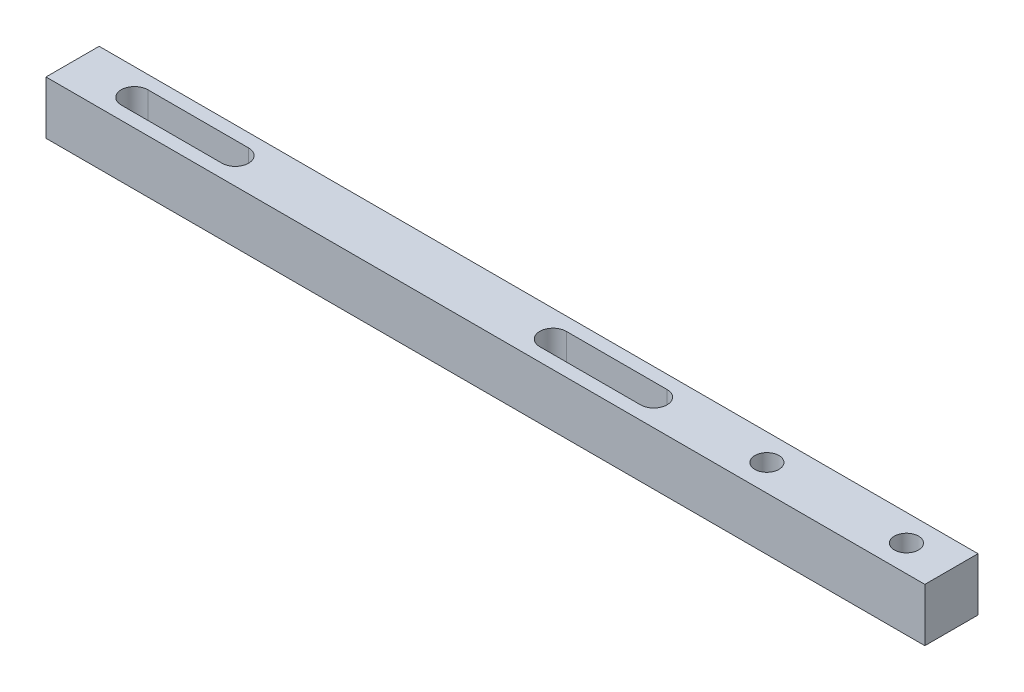
ISO-10303-21;
HEADER;
FILE_DESCRIPTION(('STEP AP214'),'2;1');
FILE_NAME('part.step','',(''),(''),'','','');
FILE_SCHEMA(('AUTOMOTIVE_DESIGN { 1 0 10303 214 1 1 1 1 }'));
ENDSEC;
DATA;
#1=APPLICATION_CONTEXT('core data for automotive mechanical design processes');
#2=APPLICATION_PROTOCOL_DEFINITION('international standard','automotive_design',2000,#1);
#3=PRODUCT_CONTEXT('',#1,'mechanical');
#4=PRODUCT('Part','Part','',(#3));
#5=PRODUCT_RELATED_PRODUCT_CATEGORY('part','',(#4));
#6=PRODUCT_DEFINITION_FORMATION('','',#4);
#7=PRODUCT_DEFINITION_CONTEXT('part definition',#1,'design');
#8=PRODUCT_DEFINITION('design','',#6,#7);
#9=PRODUCT_DEFINITION_SHAPE('','',#8);
#10=(LENGTH_UNIT() NAMED_UNIT(*) SI_UNIT(.MILLI.,.METRE.));
#11=(NAMED_UNIT(*) PLANE_ANGLE_UNIT() SI_UNIT($,.RADIAN.));
#12=(NAMED_UNIT(*) SI_UNIT($,.STERADIAN.) SOLID_ANGLE_UNIT());
#13=UNCERTAINTY_MEASURE_WITH_UNIT(LENGTH_MEASURE(1.E-05),#10,'distance_accuracy_value','');
#14=(GEOMETRIC_REPRESENTATION_CONTEXT(3) GLOBAL_UNCERTAINTY_ASSIGNED_CONTEXT((#13)) GLOBAL_UNIT_ASSIGNED_CONTEXT((#10,
#11,#12)) REPRESENTATION_CONTEXT('',''));
#15=CARTESIAN_POINT('',(0.,0.,0.));
#16=DIRECTION('',(0.,0.,1.));
#17=DIRECTION('',(1.,0.,0.));
#18=AXIS2_PLACEMENT_3D('',#15,#16,#17);
#19=CARTESIAN_POINT('',(210.,-12.7,12.7));
#20=DIRECTION('',(0.,0.,-1.));
#21=DIRECTION('',(-1.,0.,0.));
#22=AXIS2_PLACEMENT_3D('',#19,#20,#21);
#23=PLANE('',#22);
#24=DIRECTION('',(0.,-1.,0.));
#25=VECTOR('',#24,1.);
#26=CARTESIAN_POINT('',(-210.,-12.7,12.7));
#27=LINE('',#26,#25);
#28=CARTESIAN_POINT('',(-210.,12.7,12.7));
#29=VERTEX_POINT('',#28);
#30=CARTESIAN_POINT('',(-210.,-12.7,12.7));
#31=VERTEX_POINT('',#30);
#32=EDGE_CURVE('E195',#29,#31,#27,.T.);
#33=ORIENTED_EDGE('',*,*,#32,.T.);
#34=DIRECTION('',(-1.,0.,0.));
#35=VECTOR('',#34,1.);
#36=CARTESIAN_POINT('',(210.,-12.7,12.7));
#37=LINE('',#36,#35);
#38=CARTESIAN_POINT('',(210.,-12.7,12.7));
#39=VERTEX_POINT('',#38);
#40=EDGE_CURVE('E11',#39,#31,#37,.T.);
#41=ORIENTED_EDGE('',*,*,#40,.F.);
#42=DIRECTION('',(0.,-1.,0.));
#43=VECTOR('',#42,1.);
#44=CARTESIAN_POINT('',(210.,-12.7,12.7));
#45=LINE('',#44,#43);
#46=CARTESIAN_POINT('',(210.,12.7,12.7));
#47=VERTEX_POINT('',#46);
#48=EDGE_CURVE('E202',#47,#39,#45,.T.);
#49=ORIENTED_EDGE('',*,*,#48,.F.);
#50=DIRECTION('',(-1.,0.,0.));
#51=VECTOR('',#50,1.);
#52=CARTESIAN_POINT('',(210.,12.7,12.7));
#53=LINE('',#52,#51);
#54=EDGE_CURVE('E212',#47,#29,#53,.T.);
#55=ORIENTED_EDGE('',*,*,#54,.T.);
#56=EDGE_LOOP('',(#33,#41,#49,#55));
#57=FACE_BOUND('',#56,.T.);
#58=ADVANCED_FACE('F33',(#57),#23,.F.);
#59=CARTESIAN_POINT('',(210.,-12.7,-12.7));
#60=DIRECTION('',(0.,1.,0.));
#61=DIRECTION('',(0.,0.,1.));
#62=AXIS2_PLACEMENT_3D('',#59,#60,#61);
#63=PLANE('',#62);
#64=CARTESIAN_POINT('',(188.504509996072,-12.7,0.));
#65=DIRECTION('',(0.,1.,0.));
#66=DIRECTION('',(0.,0.,1.));
#67=AXIS2_PLACEMENT_3D('',#64,#65,#66);
#68=CIRCLE('',#67,5.7656275460345);
#69=CARTESIAN_POINT('',(188.504509996072,-12.7,5.7656275460345));
#70=VERTEX_POINT('',#69);
#71=EDGE_CURVE('E149',#70,#70,#68,.T.);
#72=ORIENTED_EDGE('',*,*,#71,.T.);
#73=EDGE_LOOP('',(#72));
#74=FACE_BOUND('',#73,.T.);
#75=DIRECTION('',(-1.,0.,0.));
#76=VECTOR('',#75,1.);
#77=CARTESIAN_POINT('',(19.6069408092348,-12.7,-6.35));
#78=LINE('',#77,#76);
#79=CARTESIAN_POINT('',(67.7663929182558,-12.7,-6.35));
#80=VERTEX_POINT('',#79);
#81=CARTESIAN_POINT('',(19.6069408092348,-12.7,-6.35));
#82=VERTEX_POINT('',#81);
#83=EDGE_CURVE('E129',#80,#82,#78,.T.);
#84=ORIENTED_EDGE('',*,*,#83,.T.);
#85=CARTESIAN_POINT('',(19.6069408092348,-12.7,0.));
#86=DIRECTION('',(0.,1.,0.));
#87=DIRECTION('',(0.,0.,1.));
#88=AXIS2_PLACEMENT_3D('',#85,#86,#87);
#89=CIRCLE('',#88,6.35);
#90=CARTESIAN_POINT('',(19.6069408092348,-12.7,6.35));
#91=VERTEX_POINT('',#90);
#92=EDGE_CURVE('E123',#82,#91,#89,.T.);
#93=ORIENTED_EDGE('',*,*,#92,.T.);
#94=DIRECTION('',(1.,0.,0.));
#95=VECTOR('',#94,1.);
#96=CARTESIAN_POINT('',(19.6069408092348,-12.7,6.35));
#97=LINE('',#96,#95);
#98=CARTESIAN_POINT('',(67.7663929182558,-12.7,6.35));
#99=VERTEX_POINT('',#98);
#100=EDGE_CURVE('E132',#91,#99,#97,.T.);
#101=ORIENTED_EDGE('',*,*,#100,.T.);
#102=CARTESIAN_POINT('',(67.7663929182558,-12.7,0.));
#103=DIRECTION('',(0.,1.,0.));
#104=DIRECTION('',(0.,0.,1.));
#105=AXIS2_PLACEMENT_3D('',#102,#103,#104);
#106=CIRCLE('',#105,6.35);
#107=EDGE_CURVE('E47',#99,#80,#106,.T.);
#108=ORIENTED_EDGE('',*,*,#107,.T.);
#109=EDGE_LOOP('',(#84,#93,#101,#108));
#110=FACE_BOUND('',#109,.T.);
#111=CARTESIAN_POINT('',(121.805313165541,-12.7,0.));
#112=DIRECTION('',(0.,1.,0.));
#113=DIRECTION('',(0.,0.,1.));
#114=AXIS2_PLACEMENT_3D('',#111,#112,#113);
#115=CIRCLE('',#114,5.76562754603461);
#116=CARTESIAN_POINT('',(121.805313165541,-12.7,5.7656275460346));
#117=VERTEX_POINT('',#116);
#118=EDGE_CURVE('E164',#117,#117,#115,.T.);
#119=ORIENTED_EDGE('',*,*,#118,.T.);
#120=EDGE_LOOP('',(#119));
#121=FACE_BOUND('',#120,.T.);
#122=DIRECTION('',(-1.,0.,0.));
#123=VECTOR('',#122,1.);
#124=CARTESIAN_POINT('',(-180.393059190765,-12.7,-6.35));
#125=LINE('',#124,#123);
#126=CARTESIAN_POINT('',(-132.233607081744,-12.7,-6.35));
#127=VERTEX_POINT('',#126);
#128=CARTESIAN_POINT('',(-180.393059190765,-12.7,-6.35));
#129=VERTEX_POINT('',#128);
#130=EDGE_CURVE('E180',#127,#129,#125,.T.);
#131=ORIENTED_EDGE('',*,*,#130,.T.);
#132=CARTESIAN_POINT('',(-180.393059190765,-12.7,0.));
#133=DIRECTION('',(0.,1.,0.));
#134=DIRECTION('',(0.,0.,1.));
#135=AXIS2_PLACEMENT_3D('',#132,#133,#134);
#136=CIRCLE('',#135,6.35);
#137=CARTESIAN_POINT('',(-180.393059190765,-12.7,6.35));
#138=VERTEX_POINT('',#137);
#139=EDGE_CURVE('E170',#129,#138,#136,.T.);
#140=ORIENTED_EDGE('',*,*,#139,.T.);
#141=DIRECTION('',(1.,0.,0.));
#142=VECTOR('',#141,1.);
#143=CARTESIAN_POINT('',(-180.393059190765,-12.7,6.35));
#144=LINE('',#143,#142);
#145=CARTESIAN_POINT('',(-132.233607081744,-12.7,6.35));
#146=VERTEX_POINT('',#145);
#147=EDGE_CURVE('E173',#138,#146,#144,.T.);
#148=ORIENTED_EDGE('',*,*,#147,.T.);
#149=CARTESIAN_POINT('',(-132.233607081744,-12.7,0.));
#150=DIRECTION('',(0.,1.,0.));
#151=DIRECTION('',(0.,0.,1.));
#152=AXIS2_PLACEMENT_3D('',#149,#150,#151);
#153=CIRCLE('',#152,6.35);
#154=EDGE_CURVE('E177',#146,#127,#153,.T.);
#155=ORIENTED_EDGE('',*,*,#154,.T.);
#156=EDGE_LOOP('',(#131,#140,#148,#155));
#157=FACE_BOUND('',#156,.T.);
#158=DIRECTION('',(0.,0.,-1.));
#159=VECTOR('',#158,1.);
#160=CARTESIAN_POINT('',(-210.,-12.7,-12.7));
#161=LINE('',#160,#159);
#162=CARTESIAN_POINT('',(-210.,-12.7,-12.7));
#163=VERTEX_POINT('',#162);
#164=EDGE_CURVE('E215',#31,#163,#161,.T.);
#165=ORIENTED_EDGE('',*,*,#164,.T.);
#166=DIRECTION('',(-1.,0.,0.));
#167=VECTOR('',#166,1.);
#168=CARTESIAN_POINT('',(210.,-12.7,-12.7));
#169=LINE('',#168,#167);
#170=CARTESIAN_POINT('',(210.,-12.7,-12.7));
#171=VERTEX_POINT('',#170);
#172=EDGE_CURVE('E40',#171,#163,#169,.T.);
#173=ORIENTED_EDGE('',*,*,#172,.F.);
#174=DIRECTION('',(0.,0.,-1.));
#175=VECTOR('',#174,1.);
#176=CARTESIAN_POINT('',(210.,-12.7,-12.7));
#177=LINE('',#176,#175);
#178=EDGE_CURVE('E205',#39,#171,#177,.T.);
#179=ORIENTED_EDGE('',*,*,#178,.F.);
#180=ORIENTED_EDGE('',*,*,#40,.T.);
#181=EDGE_LOOP('',(#165,#173,#179,#180));
#182=FACE_BOUND('',#181,.T.);
#183=ADVANCED_FACE('F136',(#74,#110,#121,#157,#182),#63,.F.);
#184=CARTESIAN_POINT('',(210.,-12.7,-12.7));
#185=DIRECTION('',(0.,0.,1.));
#186=DIRECTION('',(1.,0.,0.));
#187=AXIS2_PLACEMENT_3D('',#184,#185,#186);
#188=PLANE('',#187);
#189=DIRECTION('',(0.,1.,0.));
#190=VECTOR('',#189,1.);
#191=CARTESIAN_POINT('',(-210.,-12.7,-12.7));
#192=LINE('',#191,#190);
#193=CARTESIAN_POINT('',(-210.,12.7,-12.7));
#194=VERTEX_POINT('',#193);
#195=EDGE_CURVE('E217',#163,#194,#192,.T.);
#196=ORIENTED_EDGE('',*,*,#195,.T.);
#197=DIRECTION('',(-1.,0.,0.));
#198=VECTOR('',#197,1.);
#199=CARTESIAN_POINT('',(210.,12.7,-12.7));
#200=LINE('',#199,#198);
#201=CARTESIAN_POINT('',(210.,12.7,-12.7));
#202=VERTEX_POINT('',#201);
#203=EDGE_CURVE('E222',#202,#194,#200,.T.);
#204=ORIENTED_EDGE('',*,*,#203,.F.);
#205=DIRECTION('',(0.,1.,0.));
#206=VECTOR('',#205,1.);
#207=CARTESIAN_POINT('',(210.,-12.7,-12.7));
#208=LINE('',#207,#206);
#209=EDGE_CURVE('E208',#171,#202,#208,.T.);
#210=ORIENTED_EDGE('',*,*,#209,.F.);
#211=ORIENTED_EDGE('',*,*,#172,.T.);
#212=EDGE_LOOP('',(#196,#204,#210,#211));
#213=FACE_BOUND('',#212,.T.);
#214=ADVANCED_FACE('F229',(#213),#188,.F.);
#215=CARTESIAN_POINT('',(210.,12.7,-12.7));
#216=DIRECTION('',(0.,-1.,0.));
#217=DIRECTION('',(0.,0.,-1.));
#218=AXIS2_PLACEMENT_3D('',#215,#216,#217);
#219=PLANE('',#218);
#220=CARTESIAN_POINT('',(188.504509996072,12.7,0.));
#221=DIRECTION('',(0.,1.,0.));
#222=DIRECTION('',(0.,0.,1.));
#223=AXIS2_PLACEMENT_3D('',#220,#221,#222);
#224=CIRCLE('',#223,5.7656275460345);
#225=CARTESIAN_POINT('',(188.504509996072,12.7,5.76562754603451));
#226=VERTEX_POINT('',#225);
#227=EDGE_CURVE('E161',#226,#226,#224,.T.);
#228=ORIENTED_EDGE('',*,*,#227,.F.);
#229=EDGE_LOOP('',(#228));
#230=FACE_BOUND('',#229,.T.);
#231=DIRECTION('',(1.,0.,0.));
#232=VECTOR('',#231,1.);
#233=CARTESIAN_POINT('',(19.6069408092348,12.7,6.35));
#234=LINE('',#233,#232);
#235=CARTESIAN_POINT('',(19.6069408092348,12.7,6.35));
#236=VERTEX_POINT('',#235);
#237=CARTESIAN_POINT('',(67.7663929182558,12.7,6.35));
#238=VERTEX_POINT('',#237);
#239=EDGE_CURVE('E148',#236,#238,#234,.T.);
#240=ORIENTED_EDGE('',*,*,#239,.F.);
#241=CARTESIAN_POINT('',(19.6069408092348,12.7,0.));
#242=DIRECTION('',(0.,1.,0.));
#243=DIRECTION('',(0.,0.,1.));
#244=AXIS2_PLACEMENT_3D('',#241,#242,#243);
#245=CIRCLE('',#244,6.35);
#246=CARTESIAN_POINT('',(19.6069408092348,12.7,-6.35));
#247=VERTEX_POINT('',#246);
#248=EDGE_CURVE('E55',#247,#236,#245,.T.);
#249=ORIENTED_EDGE('',*,*,#248,.F.);
#250=DIRECTION('',(-1.,0.,0.));
#251=VECTOR('',#250,1.);
#252=CARTESIAN_POINT('',(19.6069408092348,12.7,-6.35));
#253=LINE('',#252,#251);
#254=CARTESIAN_POINT('',(67.7663929182558,12.7,-6.35));
#255=VERTEX_POINT('',#254);
#256=EDGE_CURVE('E139',#255,#247,#253,.T.);
#257=ORIENTED_EDGE('',*,*,#256,.F.);
#258=CARTESIAN_POINT('',(67.7663929182558,12.7,0.));
#259=DIRECTION('',(0.,1.,0.));
#260=DIRECTION('',(0.,0.,1.));
#261=AXIS2_PLACEMENT_3D('',#258,#259,#260);
#262=CIRCLE('',#261,6.35);
#263=EDGE_CURVE('E142',#238,#255,#262,.T.);
#264=ORIENTED_EDGE('',*,*,#263,.F.);
#265=EDGE_LOOP('',(#240,#249,#257,#264));
#266=FACE_BOUND('',#265,.T.);
#267=CARTESIAN_POINT('',(121.805313165541,12.7,0.));
#268=DIRECTION('',(0.,1.,0.));
#269=DIRECTION('',(0.,0.,1.));
#270=AXIS2_PLACEMENT_3D('',#267,#268,#269);
#271=CIRCLE('',#270,5.76562754603461);
#272=CARTESIAN_POINT('',(121.805313165541,12.7,5.76562754603461));
#273=VERTEX_POINT('',#272);
#274=EDGE_CURVE('E155',#273,#273,#271,.T.);
#275=ORIENTED_EDGE('',*,*,#274,.F.);
#276=EDGE_LOOP('',(#275));
#277=FACE_BOUND('',#276,.T.);
#278=DIRECTION('',(1.,0.,0.));
#279=VECTOR('',#278,1.);
#280=CARTESIAN_POINT('',(-180.393059190765,12.7,6.35));
#281=LINE('',#280,#279);
#282=CARTESIAN_POINT('',(-180.393059190765,12.7,6.35));
#283=VERTEX_POINT('',#282);
#284=CARTESIAN_POINT('',(-132.233607081744,12.7,6.35));
#285=VERTEX_POINT('',#284);
#286=EDGE_CURVE('E185',#283,#285,#281,.T.);
#287=ORIENTED_EDGE('',*,*,#286,.F.);
#288=CARTESIAN_POINT('',(-180.393059190765,12.7,0.));
#289=DIRECTION('',(0.,1.,0.));
#290=DIRECTION('',(0.,0.,1.));
#291=AXIS2_PLACEMENT_3D('',#288,#289,#290);
#292=CIRCLE('',#291,6.35);
#293=CARTESIAN_POINT('',(-180.393059190765,12.7,-6.35));
#294=VERTEX_POINT('',#293);
#295=EDGE_CURVE('E167',#294,#283,#292,.T.);
#296=ORIENTED_EDGE('',*,*,#295,.F.);
#297=DIRECTION('',(-1.,0.,0.));
#298=VECTOR('',#297,1.);
#299=CARTESIAN_POINT('',(-180.393059190765,12.7,-6.35));
#300=LINE('',#299,#298);
#301=CARTESIAN_POINT('',(-132.233607081744,12.7,-6.35));
#302=VERTEX_POINT('',#301);
#303=EDGE_CURVE('E174',#302,#294,#300,.T.);
#304=ORIENTED_EDGE('',*,*,#303,.F.);
#305=CARTESIAN_POINT('',(-132.233607081744,12.7,0.));
#306=DIRECTION('',(0.,1.,0.));
#307=DIRECTION('',(0.,0.,1.));
#308=AXIS2_PLACEMENT_3D('',#305,#306,#307);
#309=CIRCLE('',#308,6.35);
#310=EDGE_CURVE('E188',#285,#302,#309,.T.);
#311=ORIENTED_EDGE('',*,*,#310,.F.);
#312=EDGE_LOOP('',(#287,#296,#304,#311));
#313=FACE_BOUND('',#312,.T.);
#314=DIRECTION('',(0.,0.,1.));
#315=VECTOR('',#314,1.);
#316=CARTESIAN_POINT('',(-210.,12.7,-12.7));
#317=LINE('',#316,#315);
#318=EDGE_CURVE('E206',#194,#29,#317,.T.);
#319=ORIENTED_EDGE('',*,*,#318,.T.);
#320=ORIENTED_EDGE('',*,*,#54,.F.);
#321=DIRECTION('',(0.,0.,1.));
#322=VECTOR('',#321,1.);
#323=CARTESIAN_POINT('',(210.,12.7,-12.7));
#324=LINE('',#323,#322);
#325=EDGE_CURVE('E210',#202,#47,#324,.T.);
#326=ORIENTED_EDGE('',*,*,#325,.F.);
#327=ORIENTED_EDGE('',*,*,#203,.T.);
#328=EDGE_LOOP('',(#319,#320,#326,#327));
#329=FACE_BOUND('',#328,.T.);
#330=ADVANCED_FACE('F238',(#230,#266,#277,#313,#329),#219,.F.);
#331=CARTESIAN_POINT('',(210.,0.,0.));
#332=DIRECTION('',(1.,0.,0.));
#333=DIRECTION('',(0.,0.,-1.));
#334=AXIS2_PLACEMENT_3D('',#331,#332,#333);
#335=PLANE('',#334);
#336=ORIENTED_EDGE('',*,*,#48,.T.);
#337=ORIENTED_EDGE('',*,*,#178,.T.);
#338=ORIENTED_EDGE('',*,*,#209,.T.);
#339=ORIENTED_EDGE('',*,*,#325,.T.);
#340=EDGE_LOOP('',(#336,#337,#338,#339));
#341=FACE_BOUND('',#340,.T.);
#342=ADVANCED_FACE('F244',(#341),#335,.T.);
#343=CARTESIAN_POINT('',(-210.,0.,0.));
#344=DIRECTION('',(1.,0.,0.));
#345=DIRECTION('',(0.,0.,-1.));
#346=AXIS2_PLACEMENT_3D('',#343,#344,#345);
#347=PLANE('',#346);
#348=ORIENTED_EDGE('',*,*,#32,.F.);
#349=ORIENTED_EDGE('',*,*,#318,.F.);
#350=ORIENTED_EDGE('',*,*,#195,.F.);
#351=ORIENTED_EDGE('',*,*,#164,.F.);
#352=EDGE_LOOP('',(#348,#349,#350,#351));
#353=FACE_BOUND('',#352,.T.);
#354=ADVANCED_FACE('F235',(#353),#347,.F.);
#355=CARTESIAN_POINT('',(-180.393059190765,-12.7,0.));
#356=DIRECTION('',(0.,1.,0.));
#357=DIRECTION('',(0.,0.,1.));
#358=AXIS2_PLACEMENT_3D('',#355,#356,#357);
#359=CYLINDRICAL_SURFACE('',#358,6.35);
#360=ORIENTED_EDGE('',*,*,#295,.T.);
#361=DIRECTION('',(0.,1.,0.));
#362=VECTOR('',#361,1.);
#363=CARTESIAN_POINT('',(-180.393059190765,-12.7,6.35));
#364=LINE('',#363,#362);
#365=EDGE_CURVE('E183',#138,#283,#364,.T.);
#366=ORIENTED_EDGE('',*,*,#365,.F.);
#367=ORIENTED_EDGE('',*,*,#139,.F.);
#368=DIRECTION('',(0.,1.,0.));
#369=VECTOR('',#368,1.);
#370=CARTESIAN_POINT('',(-180.393059190765,-12.7,-6.35));
#371=LINE('',#370,#369);
#372=EDGE_CURVE('E193',#129,#294,#371,.T.);
#373=ORIENTED_EDGE('',*,*,#372,.T.);
#374=EDGE_LOOP('',(#360,#366,#367,#373));
#375=FACE_BOUND('',#374,.T.);
#376=ADVANCED_FACE('F258',(#375),#359,.F.);
#377=CARTESIAN_POINT('',(-180.393059190765,-12.7,-6.35));
#378=DIRECTION('',(0.,0.,-1.));
#379=DIRECTION('',(0.,1.,0.));
#380=AXIS2_PLACEMENT_3D('',#377,#378,#379);
#381=PLANE('',#380);
#382=ORIENTED_EDGE('',*,*,#303,.T.);
#383=ORIENTED_EDGE('',*,*,#372,.F.);
#384=ORIENTED_EDGE('',*,*,#130,.F.);
#385=DIRECTION('',(0.,1.,0.));
#386=VECTOR('',#385,1.);
#387=CARTESIAN_POINT('',(-132.233607081744,-12.7,-6.35));
#388=LINE('',#387,#386);
#389=EDGE_CURVE('E196',#127,#302,#388,.T.);
#390=ORIENTED_EDGE('',*,*,#389,.T.);
#391=EDGE_LOOP('',(#382,#383,#384,#390));
#392=FACE_BOUND('',#391,.T.);
#393=ADVANCED_FACE('F263',(#392),#381,.F.);
#394=CARTESIAN_POINT('',(-132.233607081744,-12.7,0.));
#395=DIRECTION('',(0.,1.,0.));
#396=DIRECTION('',(0.,0.,1.));
#397=AXIS2_PLACEMENT_3D('',#394,#395,#396);
#398=CYLINDRICAL_SURFACE('',#397,6.35);
#399=ORIENTED_EDGE('',*,*,#310,.T.);
#400=ORIENTED_EDGE('',*,*,#389,.F.);
#401=ORIENTED_EDGE('',*,*,#154,.F.);
#402=DIRECTION('',(0.,1.,0.));
#403=VECTOR('',#402,1.);
#404=CARTESIAN_POINT('',(-132.233607081744,-12.7,6.35));
#405=LINE('',#404,#403);
#406=EDGE_CURVE('E198',#146,#285,#405,.T.);
#407=ORIENTED_EDGE('',*,*,#406,.T.);
#408=EDGE_LOOP('',(#399,#400,#401,#407));
#409=FACE_BOUND('',#408,.T.);
#410=ADVANCED_FACE('F269',(#409),#398,.F.);
#411=CARTESIAN_POINT('',(-180.393059190765,-12.7,6.35));
#412=DIRECTION('',(0.,0.,1.));
#413=DIRECTION('',(0.,-1.,0.));
#414=AXIS2_PLACEMENT_3D('',#411,#412,#413);
#415=PLANE('',#414);
#416=ORIENTED_EDGE('',*,*,#286,.T.);
#417=ORIENTED_EDGE('',*,*,#406,.F.);
#418=ORIENTED_EDGE('',*,*,#147,.F.);
#419=ORIENTED_EDGE('',*,*,#365,.T.);
#420=EDGE_LOOP('',(#416,#417,#418,#419));
#421=FACE_BOUND('',#420,.T.);
#422=ADVANCED_FACE('F265',(#421),#415,.F.);
#423=CARTESIAN_POINT('',(121.805313165541,-12.7,0.));
#424=DIRECTION('',(0.,1.,0.));
#425=DIRECTION('',(0.,0.,1.));
#426=AXIS2_PLACEMENT_3D('',#423,#424,#425);
#427=CYLINDRICAL_SURFACE('',#426,5.76562754603461);
#428=ORIENTED_EDGE('',*,*,#118,.F.);
#429=EDGE_LOOP('',(#428));
#430=FACE_BOUND('',#429,.T.);
#431=ORIENTED_EDGE('',*,*,#274,.T.);
#432=EDGE_LOOP('',(#431));
#433=FACE_BOUND('',#432,.T.);
#434=ADVANCED_FACE('F268',(#430,#433),#427,.F.);
#435=CARTESIAN_POINT('',(19.6069408092348,-12.7,0.));
#436=DIRECTION('',(0.,1.,0.));
#437=DIRECTION('',(0.,0.,1.));
#438=AXIS2_PLACEMENT_3D('',#435,#436,#437);
#439=CYLINDRICAL_SURFACE('',#438,6.35);
#440=ORIENTED_EDGE('',*,*,#248,.T.);
#441=DIRECTION('',(0.,1.,0.));
#442=VECTOR('',#441,1.);
#443=CARTESIAN_POINT('',(19.6069408092348,-12.7,6.35));
#444=LINE('',#443,#442);
#445=EDGE_CURVE('E119',#91,#236,#444,.T.);
#446=ORIENTED_EDGE('',*,*,#445,.F.);
#447=ORIENTED_EDGE('',*,*,#92,.F.);
#448=DIRECTION('',(0.,1.,0.));
#449=VECTOR('',#448,1.);
#450=CARTESIAN_POINT('',(19.6069408092348,-12.7,-6.35));
#451=LINE('',#450,#449);
#452=EDGE_CURVE('E153',#82,#247,#451,.T.);
#453=ORIENTED_EDGE('',*,*,#452,.T.);
#454=EDGE_LOOP('',(#440,#446,#447,#453));
#455=FACE_BOUND('',#454,.T.);
#456=ADVANCED_FACE('F121',(#455),#439,.F.);
#457=CARTESIAN_POINT('',(19.6069408092348,-12.7,-6.35));
#458=DIRECTION('',(0.,0.,-1.));
#459=DIRECTION('',(0.,1.,0.));
#460=AXIS2_PLACEMENT_3D('',#457,#458,#459);
#461=PLANE('',#460);
#462=ORIENTED_EDGE('',*,*,#256,.T.);
#463=ORIENTED_EDGE('',*,*,#452,.F.);
#464=ORIENTED_EDGE('',*,*,#83,.F.);
#465=DIRECTION('',(0.,1.,0.));
#466=VECTOR('',#465,1.);
#467=CARTESIAN_POINT('',(67.7663929182558,-12.7,-6.35));
#468=LINE('',#467,#466);
#469=EDGE_CURVE('E156',#80,#255,#468,.T.);
#470=ORIENTED_EDGE('',*,*,#469,.T.);
#471=EDGE_LOOP('',(#462,#463,#464,#470));
#472=FACE_BOUND('',#471,.T.);
#473=ADVANCED_FACE('F286',(#472),#461,.F.);
#474=CARTESIAN_POINT('',(67.7663929182558,-12.7,0.));
#475=DIRECTION('',(0.,1.,0.));
#476=DIRECTION('',(0.,0.,1.));
#477=AXIS2_PLACEMENT_3D('',#474,#475,#476);
#478=CYLINDRICAL_SURFACE('',#477,6.35);
#479=ORIENTED_EDGE('',*,*,#263,.T.);
#480=ORIENTED_EDGE('',*,*,#469,.F.);
#481=ORIENTED_EDGE('',*,*,#107,.F.);
#482=DIRECTION('',(0.,1.,0.));
#483=VECTOR('',#482,1.);
#484=CARTESIAN_POINT('',(67.7663929182558,-12.7,6.35));
#485=LINE('',#484,#483);
#486=EDGE_CURVE('E128',#99,#238,#485,.T.);
#487=ORIENTED_EDGE('',*,*,#486,.T.);
#488=EDGE_LOOP('',(#479,#480,#481,#487));
#489=FACE_BOUND('',#488,.T.);
#490=ADVANCED_FACE('F289',(#489),#478,.F.);
#491=CARTESIAN_POINT('',(19.6069408092348,-12.7,6.35));
#492=DIRECTION('',(0.,0.,1.));
#493=DIRECTION('',(0.,-1.,0.));
#494=AXIS2_PLACEMENT_3D('',#491,#492,#493);
#495=PLANE('',#494);
#496=ORIENTED_EDGE('',*,*,#239,.T.);
#497=ORIENTED_EDGE('',*,*,#486,.F.);
#498=ORIENTED_EDGE('',*,*,#100,.F.);
#499=ORIENTED_EDGE('',*,*,#445,.T.);
#500=EDGE_LOOP('',(#496,#497,#498,#499));
#501=FACE_BOUND('',#500,.T.);
#502=ADVANCED_FACE('F133',(#501),#495,.F.);
#503=CARTESIAN_POINT('',(188.504509996072,-12.7,0.));
#504=DIRECTION('',(0.,1.,0.));
#505=DIRECTION('',(0.,0.,1.));
#506=AXIS2_PLACEMENT_3D('',#503,#504,#505);
#507=CYLINDRICAL_SURFACE('',#506,5.7656275460345);
#508=ORIENTED_EDGE('',*,*,#71,.F.);
#509=EDGE_LOOP('',(#508));
#510=FACE_BOUND('',#509,.T.);
#511=ORIENTED_EDGE('',*,*,#227,.T.);
#512=EDGE_LOOP('',(#511));
#513=FACE_BOUND('',#512,.T.);
#514=ADVANCED_FACE('F280',(#510,#513),#507,.F.);
#515=CLOSED_SHELL('',(#58,#183,#214,#330,#342,#354,#376,#393,#410,#422,#434,#456,#473,#490,#502,#514));
#516=MANIFOLD_SOLID_BREP('B2',#515);
#517=ADVANCED_BREP_SHAPE_REPRESENTATION('',(#18,#516),#14);
#518=SHAPE_DEFINITION_REPRESENTATION(#9,#517);
ENDSEC;
END-ISO-10303-21;
